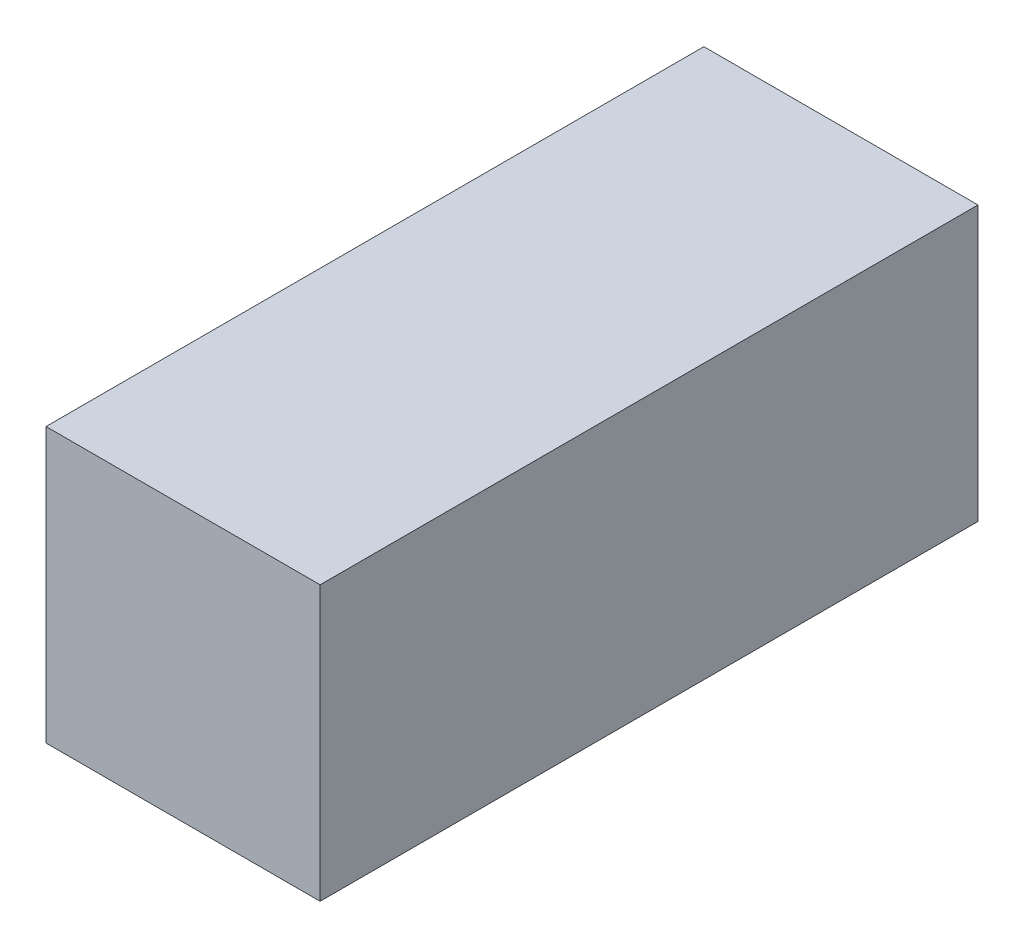
ISO-10303-21;
HEADER;
FILE_DESCRIPTION(('STEP AP214'),'2;1');
FILE_NAME('part.step','',(''),(''),'','','');
FILE_SCHEMA(('AUTOMOTIVE_DESIGN { 1 0 10303 214 1 1 1 1 }'));
ENDSEC;
DATA;
#1=APPLICATION_CONTEXT('core data for automotive mechanical design processes');
#2=APPLICATION_PROTOCOL_DEFINITION('international standard','automotive_design',2000,#1);
#3=PRODUCT_CONTEXT('',#1,'mechanical');
#4=PRODUCT('Part','Part','',(#3));
#5=PRODUCT_RELATED_PRODUCT_CATEGORY('part','',(#4));
#6=PRODUCT_DEFINITION_FORMATION('','',#4);
#7=PRODUCT_DEFINITION_CONTEXT('part definition',#1,'design');
#8=PRODUCT_DEFINITION('design','',#6,#7);
#9=PRODUCT_DEFINITION_SHAPE('','',#8);
#10=(LENGTH_UNIT() NAMED_UNIT(*) SI_UNIT(.MILLI.,.METRE.));
#11=(NAMED_UNIT(*) PLANE_ANGLE_UNIT() SI_UNIT($,.RADIAN.));
#12=(NAMED_UNIT(*) SI_UNIT($,.STERADIAN.) SOLID_ANGLE_UNIT());
#13=UNCERTAINTY_MEASURE_WITH_UNIT(LENGTH_MEASURE(1.E-05),#10,'distance_accuracy_value','');
#14=(GEOMETRIC_REPRESENTATION_CONTEXT(3) GLOBAL_UNCERTAINTY_ASSIGNED_CONTEXT((#13)) GLOBAL_UNIT_ASSIGNED_CONTEXT((#10,
#11,#12)) REPRESENTATION_CONTEXT('',''));
#15=CARTESIAN_POINT('',(0.,0.,0.));
#16=DIRECTION('',(0.,0.,1.));
#17=DIRECTION('',(1.,0.,0.));
#18=AXIS2_PLACEMENT_3D('',#15,#16,#17);
#19=CARTESIAN_POINT('',(-127.,-127.,609.6));
#20=DIRECTION('',(1.,0.,0.));
#21=DIRECTION('',(0.,0.,-1.));
#22=AXIS2_PLACEMENT_3D('',#19,#20,#21);
#23=PLANE('',#22);
#24=DIRECTION('',(0.,-1.,0.));
#25=VECTOR('',#24,1.);
#26=CARTESIAN_POINT('',(-127.,-127.,0.));
#27=LINE('',#26,#25);
#28=CARTESIAN_POINT('',(-127.,127.,0.));
#29=VERTEX_POINT('',#28);
#30=CARTESIAN_POINT('',(-127.,-127.,0.));
#31=VERTEX_POINT('',#30);
#32=EDGE_CURVE('E113',#29,#31,#27,.T.);
#33=ORIENTED_EDGE('',*,*,#32,.T.);
#34=DIRECTION('',(0.,0.,-1.));
#35=VECTOR('',#34,1.);
#36=CARTESIAN_POINT('',(-127.,-127.,609.6));
#37=LINE('',#36,#35);
#38=CARTESIAN_POINT('',(-127.,-127.,609.6));
#39=VERTEX_POINT('',#38);
#40=EDGE_CURVE('E11',#39,#31,#37,.T.);
#41=ORIENTED_EDGE('',*,*,#40,.F.);
#42=DIRECTION('',(0.,-1.,0.));
#43=VECTOR('',#42,1.);
#44=CARTESIAN_POINT('',(-127.,-127.,609.6));
#45=LINE('',#44,#43);
#46=CARTESIAN_POINT('',(-127.,127.,609.6));
#47=VERTEX_POINT('',#46);
#48=EDGE_CURVE('E97',#47,#39,#45,.T.);
#49=ORIENTED_EDGE('',*,*,#48,.F.);
#50=DIRECTION('',(0.,0.,-1.));
#51=VECTOR('',#50,1.);
#52=CARTESIAN_POINT('',(-127.,127.,609.6));
#53=LINE('',#52,#51);
#54=EDGE_CURVE('E109',#47,#29,#53,.T.);
#55=ORIENTED_EDGE('',*,*,#54,.T.);
#56=EDGE_LOOP('',(#33,#41,#49,#55));
#57=FACE_BOUND('',#56,.T.);
#58=ADVANCED_FACE('F45',(#57),#23,.F.);
#59=CARTESIAN_POINT('',(127.,-127.,609.6));
#60=DIRECTION('',(0.,1.,0.));
#61=DIRECTION('',(0.,0.,1.));
#62=AXIS2_PLACEMENT_3D('',#59,#60,#61);
#63=PLANE('',#62);
#64=DIRECTION('',(1.,0.,0.));
#65=VECTOR('',#64,1.);
#66=CARTESIAN_POINT('',(127.,-127.,0.));
#67=LINE('',#66,#65);
#68=CARTESIAN_POINT('',(127.,-127.,0.));
#69=VERTEX_POINT('',#68);
#70=EDGE_CURVE('E102',#31,#69,#67,.T.);
#71=ORIENTED_EDGE('',*,*,#70,.T.);
#72=DIRECTION('',(0.,0.,-1.));
#73=VECTOR('',#72,1.);
#74=CARTESIAN_POINT('',(127.,-127.,609.6));
#75=LINE('',#74,#73);
#76=CARTESIAN_POINT('',(127.,-127.,609.6));
#77=VERTEX_POINT('',#76);
#78=EDGE_CURVE('E54',#77,#69,#75,.T.);
#79=ORIENTED_EDGE('',*,*,#78,.F.);
#80=DIRECTION('',(1.,0.,0.));
#81=VECTOR('',#80,1.);
#82=CARTESIAN_POINT('',(127.,-127.,609.6));
#83=LINE('',#82,#81);
#84=EDGE_CURVE('E92',#39,#77,#83,.T.);
#85=ORIENTED_EDGE('',*,*,#84,.F.);
#86=ORIENTED_EDGE('',*,*,#40,.T.);
#87=EDGE_LOOP('',(#71,#79,#85,#86));
#88=FACE_BOUND('',#87,.T.);
#89=ADVANCED_FACE('F101',(#88),#63,.F.);
#90=CARTESIAN_POINT('',(127.,-127.,609.6));
#91=DIRECTION('',(-1.,0.,0.));
#92=DIRECTION('',(0.,0.,1.));
#93=AXIS2_PLACEMENT_3D('',#90,#91,#92);
#94=PLANE('',#93);
#95=DIRECTION('',(0.,1.,0.));
#96=VECTOR('',#95,1.);
#97=CARTESIAN_POINT('',(127.,-127.,0.));
#98=LINE('',#97,#96);
#99=CARTESIAN_POINT('',(127.,127.,0.));
#100=VERTEX_POINT('',#99);
#101=EDGE_CURVE('E79',#69,#100,#98,.T.);
#102=ORIENTED_EDGE('',*,*,#101,.T.);
#103=DIRECTION('',(0.,0.,-1.));
#104=VECTOR('',#103,1.);
#105=CARTESIAN_POINT('',(127.,127.,609.6));
#106=LINE('',#105,#104);
#107=CARTESIAN_POINT('',(127.,127.,609.6));
#108=VERTEX_POINT('',#107);
#109=EDGE_CURVE('E104',#108,#100,#106,.T.);
#110=ORIENTED_EDGE('',*,*,#109,.F.);
#111=DIRECTION('',(0.,1.,0.));
#112=VECTOR('',#111,1.);
#113=CARTESIAN_POINT('',(127.,-127.,609.6));
#114=LINE('',#113,#112);
#115=EDGE_CURVE('E95',#77,#108,#114,.T.);
#116=ORIENTED_EDGE('',*,*,#115,.F.);
#117=ORIENTED_EDGE('',*,*,#78,.T.);
#118=EDGE_LOOP('',(#102,#110,#116,#117));
#119=FACE_BOUND('',#118,.T.);
#120=ADVANCED_FACE('F105',(#119),#94,.F.);
#121=CARTESIAN_POINT('',(127.,127.,609.6));
#122=DIRECTION('',(0.,-1.,0.));
#123=DIRECTION('',(1.,0.,0.));
#124=AXIS2_PLACEMENT_3D('',#121,#122,#123);
#125=PLANE('',#124);
#126=DIRECTION('',(-1.,0.,0.));
#127=VECTOR('',#126,1.);
#128=CARTESIAN_POINT('',(127.,127.,0.));
#129=LINE('',#128,#127);
#130=EDGE_CURVE('E85',#100,#29,#129,.T.);
#131=ORIENTED_EDGE('',*,*,#130,.T.);
#132=ORIENTED_EDGE('',*,*,#54,.F.);
#133=DIRECTION('',(-1.,0.,0.));
#134=VECTOR('',#133,1.);
#135=CARTESIAN_POINT('',(127.,127.,609.6));
#136=LINE('',#135,#134);
#137=EDGE_CURVE('E62',#108,#47,#136,.T.);
#138=ORIENTED_EDGE('',*,*,#137,.F.);
#139=ORIENTED_EDGE('',*,*,#109,.T.);
#140=EDGE_LOOP('',(#131,#132,#138,#139));
#141=FACE_BOUND('',#140,.T.);
#142=ADVANCED_FACE('F126',(#141),#125,.F.);
#143=CARTESIAN_POINT('',(0.,0.,609.6));
#144=DIRECTION('',(0.,0.,1.));
#145=DIRECTION('',(1.,0.,0.));
#146=AXIS2_PLACEMENT_3D('',#143,#144,#145);
#147=PLANE('',#146);
#148=ORIENTED_EDGE('',*,*,#48,.T.);
#149=ORIENTED_EDGE('',*,*,#84,.T.);
#150=ORIENTED_EDGE('',*,*,#115,.T.);
#151=ORIENTED_EDGE('',*,*,#137,.T.);
#152=EDGE_LOOP('',(#148,#149,#150,#151));
#153=FACE_BOUND('',#152,.T.);
#154=ADVANCED_FACE('F93',(#153),#147,.T.);
#155=CARTESIAN_POINT('',(0.,0.,0.));
#156=DIRECTION('',(0.,0.,1.));
#157=DIRECTION('',(1.,0.,0.));
#158=AXIS2_PLACEMENT_3D('',#155,#156,#157);
#159=PLANE('',#158);
#160=ORIENTED_EDGE('',*,*,#32,.F.);
#161=ORIENTED_EDGE('',*,*,#130,.F.);
#162=ORIENTED_EDGE('',*,*,#101,.F.);
#163=ORIENTED_EDGE('',*,*,#70,.F.);
#164=EDGE_LOOP('',(#160,#161,#162,#163));
#165=FACE_BOUND('',#164,.T.);
#166=ADVANCED_FACE('F129',(#165),#159,.F.);
#167=CLOSED_SHELL('',(#58,#89,#120,#142,#154,#166));
#168=MANIFOLD_SOLID_BREP('B2',#167);
#169=ADVANCED_BREP_SHAPE_REPRESENTATION('',(#18,#168),#14);
#170=SHAPE_DEFINITION_REPRESENTATION(#9,#169);
ENDSEC;
END-ISO-10303-21;
